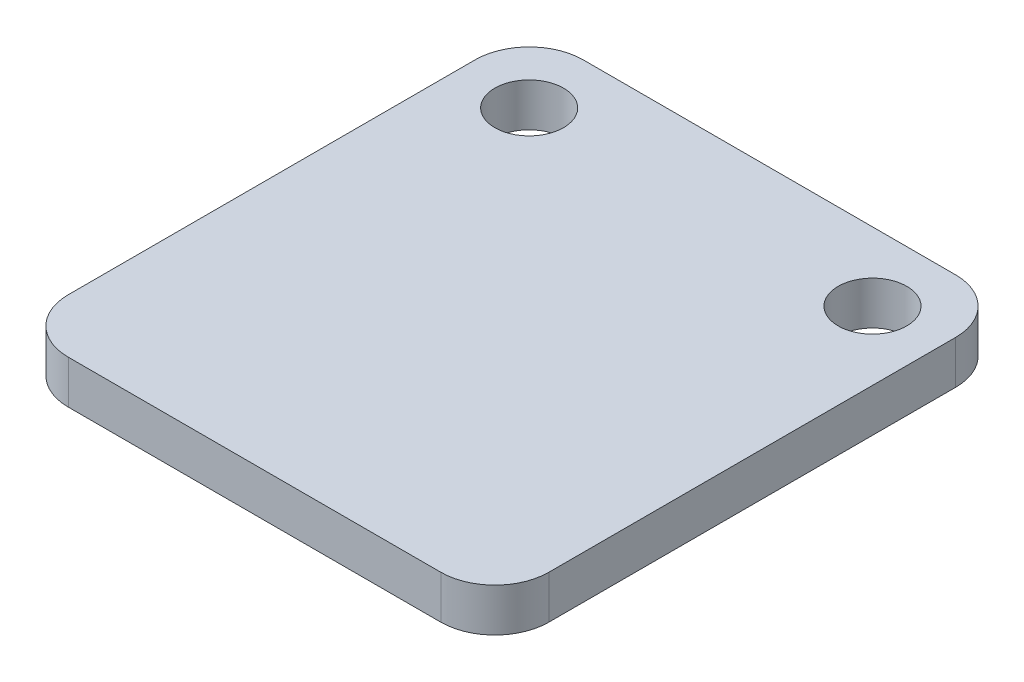
ISO-10303-21;
HEADER;
FILE_DESCRIPTION(('STEP AP214'),'2;1');
FILE_NAME('part.step','',(''),(''),'','','');
FILE_SCHEMA(('AUTOMOTIVE_DESIGN { 1 0 10303 214 1 1 1 1 }'));
ENDSEC;
DATA;
#1=APPLICATION_CONTEXT('core data for automotive mechanical design processes');
#2=APPLICATION_PROTOCOL_DEFINITION('international standard','automotive_design',2000,#1);
#3=PRODUCT_CONTEXT('',#1,'mechanical');
#4=PRODUCT('Part','Part','',(#3));
#5=PRODUCT_RELATED_PRODUCT_CATEGORY('part','',(#4));
#6=PRODUCT_DEFINITION_FORMATION('','',#4);
#7=PRODUCT_DEFINITION_CONTEXT('part definition',#1,'design');
#8=PRODUCT_DEFINITION('design','',#6,#7);
#9=PRODUCT_DEFINITION_SHAPE('','',#8);
#10=(LENGTH_UNIT() NAMED_UNIT(*) SI_UNIT(.MILLI.,.METRE.));
#11=(NAMED_UNIT(*) PLANE_ANGLE_UNIT() SI_UNIT($,.RADIAN.));
#12=(NAMED_UNIT(*) SI_UNIT($,.STERADIAN.) SOLID_ANGLE_UNIT());
#13=UNCERTAINTY_MEASURE_WITH_UNIT(LENGTH_MEASURE(1.E-05),#10,'distance_accuracy_value','');
#14=(GEOMETRIC_REPRESENTATION_CONTEXT(3) GLOBAL_UNCERTAINTY_ASSIGNED_CONTEXT((#13)) GLOBAL_UNIT_ASSIGNED_CONTEXT((#10,
#11,#12)) REPRESENTATION_CONTEXT('',''));
#15=CARTESIAN_POINT('',(0.,0.,0.));
#16=DIRECTION('',(0.,0.,1.));
#17=DIRECTION('',(1.,0.,0.));
#18=AXIS2_PLACEMENT_3D('',#15,#16,#17);
#19=CARTESIAN_POINT('',(-6.89,1.6,7.525));
#20=DIRECTION('',(0.,-1.,0.));
#21=DIRECTION('',(0.,0.,-1.));
#22=AXIS2_PLACEMENT_3D('',#19,#20,#21);
#23=CYLINDRICAL_SURFACE('',#22,2.);
#24=CARTESIAN_POINT('',(-6.89,0.,7.525));
#25=DIRECTION('',(0.,1.,0.));
#26=DIRECTION('',(0.,0.,1.));
#27=AXIS2_PLACEMENT_3D('',#24,#25,#26);
#28=CIRCLE('',#27,2.);
#29=CARTESIAN_POINT('',(-8.89,0.,7.52499999999999));
#30=VERTEX_POINT('',#29);
#31=CARTESIAN_POINT('',(-6.88999999999999,0.,9.525));
#32=VERTEX_POINT('',#31);
#33=EDGE_CURVE('E146',#30,#32,#28,.T.);
#34=ORIENTED_EDGE('',*,*,#33,.T.);
#35=DIRECTION('',(0.,-1.,0.));
#36=VECTOR('',#35,1.);
#37=CARTESIAN_POINT('',(-6.88999999999999,1.6,9.525));
#38=LINE('',#37,#36);
#39=CARTESIAN_POINT('',(-6.88999999999999,1.6,9.525));
#40=VERTEX_POINT('',#39);
#41=EDGE_CURVE('E11',#40,#32,#38,.T.);
#42=ORIENTED_EDGE('',*,*,#41,.F.);
#43=CARTESIAN_POINT('',(-6.89,1.6,7.525));
#44=DIRECTION('',(0.,1.,0.));
#45=DIRECTION('',(0.,0.,1.));
#46=AXIS2_PLACEMENT_3D('',#43,#44,#45);
#47=CIRCLE('',#46,2.);
#48=CARTESIAN_POINT('',(-8.89,1.6,7.52499999999999));
#49=VERTEX_POINT('',#48);
#50=EDGE_CURVE('E169',#49,#40,#47,.T.);
#51=ORIENTED_EDGE('',*,*,#50,.F.);
#52=DIRECTION('',(0.,-1.,0.));
#53=VECTOR('',#52,1.);
#54=CARTESIAN_POINT('',(-8.89,1.6,7.52499999999999));
#55=LINE('',#54,#53);
#56=EDGE_CURVE('E142',#49,#30,#55,.T.);
#57=ORIENTED_EDGE('',*,*,#56,.T.);
#58=EDGE_LOOP('',(#34,#42,#51,#57));
#59=FACE_BOUND('',#58,.T.);
#60=ADVANCED_FACE('F45',(#59),#23,.T.);
#61=CARTESIAN_POINT('',(-6.88999999999999,1.6,9.525));
#62=DIRECTION('',(0.,0.,-1.));
#63=DIRECTION('',(-1.,0.,0.));
#64=AXIS2_PLACEMENT_3D('',#61,#62,#63);
#65=PLANE('',#64);
#66=DIRECTION('',(1.,0.,0.));
#67=VECTOR('',#66,1.);
#68=CARTESIAN_POINT('',(-6.88999999999999,0.,9.525));
#69=LINE('',#68,#67);
#70=CARTESIAN_POINT('',(6.88999999999998,0.,9.525));
#71=VERTEX_POINT('',#70);
#72=EDGE_CURVE('E150',#32,#71,#69,.T.);
#73=ORIENTED_EDGE('',*,*,#72,.T.);
#74=DIRECTION('',(0.,-1.,0.));
#75=VECTOR('',#74,1.);
#76=CARTESIAN_POINT('',(6.88999999999998,1.6,9.525));
#77=LINE('',#76,#75);
#78=CARTESIAN_POINT('',(6.88999999999998,1.6,9.525));
#79=VERTEX_POINT('',#78);
#80=EDGE_CURVE('E54',#79,#71,#77,.T.);
#81=ORIENTED_EDGE('',*,*,#80,.F.);
#82=DIRECTION('',(1.,0.,0.));
#83=VECTOR('',#82,1.);
#84=CARTESIAN_POINT('',(-6.88999999999999,1.6,9.525));
#85=LINE('',#84,#83);
#86=EDGE_CURVE('E105',#40,#79,#85,.T.);
#87=ORIENTED_EDGE('',*,*,#86,.F.);
#88=ORIENTED_EDGE('',*,*,#41,.T.);
#89=EDGE_LOOP('',(#73,#81,#87,#88));
#90=FACE_BOUND('',#89,.T.);
#91=ADVANCED_FACE('F253',(#90),#65,.F.);
#92=CARTESIAN_POINT('',(6.89,1.6,7.525));
#93=DIRECTION('',(0.,-1.,0.));
#94=DIRECTION('',(0.,0.,-1.));
#95=AXIS2_PLACEMENT_3D('',#92,#93,#94);
#96=CYLINDRICAL_SURFACE('',#95,2.);
#97=CARTESIAN_POINT('',(6.89,0.,7.525));
#98=DIRECTION('',(0.,1.,0.));
#99=DIRECTION('',(0.,0.,1.));
#100=AXIS2_PLACEMENT_3D('',#97,#98,#99);
#101=CIRCLE('',#100,2.);
#102=CARTESIAN_POINT('',(8.89,0.,7.52499999999999));
#103=VERTEX_POINT('',#102);
#104=EDGE_CURVE('E154',#71,#103,#101,.T.);
#105=ORIENTED_EDGE('',*,*,#104,.T.);
#106=DIRECTION('',(0.,-1.,0.));
#107=VECTOR('',#106,1.);
#108=CARTESIAN_POINT('',(8.89,1.6,7.52499999999999));
#109=LINE('',#108,#107);
#110=CARTESIAN_POINT('',(8.89,1.6,7.52499999999999));
#111=VERTEX_POINT('',#110);
#112=EDGE_CURVE('E180',#111,#103,#109,.T.);
#113=ORIENTED_EDGE('',*,*,#112,.F.);
#114=CARTESIAN_POINT('',(6.89,1.6,7.525));
#115=DIRECTION('',(0.,1.,0.));
#116=DIRECTION('',(0.,0.,1.));
#117=AXIS2_PLACEMENT_3D('',#114,#115,#116);
#118=CIRCLE('',#117,2.);
#119=EDGE_CURVE('E190',#79,#111,#118,.T.);
#120=ORIENTED_EDGE('',*,*,#119,.F.);
#121=ORIENTED_EDGE('',*,*,#80,.T.);
#122=EDGE_LOOP('',(#105,#113,#120,#121));
#123=FACE_BOUND('',#122,.T.);
#124=ADVANCED_FACE('F188',(#123),#96,.T.);
#125=CARTESIAN_POINT('',(8.89,1.6,-7.52499999999999));
#126=DIRECTION('',(-1.,0.,0.));
#127=DIRECTION('',(0.,0.,1.));
#128=AXIS2_PLACEMENT_3D('',#125,#126,#127);
#129=PLANE('',#128);
#130=DIRECTION('',(0.,0.,-1.));
#131=VECTOR('',#130,1.);
#132=CARTESIAN_POINT('',(8.89,0.,-7.52499999999999));
#133=LINE('',#132,#131);
#134=CARTESIAN_POINT('',(8.89,0.,-7.52499999999999));
#135=VERTEX_POINT('',#134);
#136=EDGE_CURVE('E157',#103,#135,#133,.T.);
#137=ORIENTED_EDGE('',*,*,#136,.T.);
#138=DIRECTION('',(0.,-1.,0.));
#139=VECTOR('',#138,1.);
#140=CARTESIAN_POINT('',(8.89,1.6,-7.52499999999999));
#141=LINE('',#140,#139);
#142=CARTESIAN_POINT('',(8.89,1.6,-7.52499999999999));
#143=VERTEX_POINT('',#142);
#144=EDGE_CURVE('E176',#143,#135,#141,.T.);
#145=ORIENTED_EDGE('',*,*,#144,.F.);
#146=DIRECTION('',(0.,0.,-1.));
#147=VECTOR('',#146,1.);
#148=CARTESIAN_POINT('',(8.89,1.6,-7.52499999999999));
#149=LINE('',#148,#147);
#150=EDGE_CURVE('E203',#111,#143,#149,.T.);
#151=ORIENTED_EDGE('',*,*,#150,.F.);
#152=ORIENTED_EDGE('',*,*,#112,.T.);
#153=EDGE_LOOP('',(#137,#145,#151,#152));
#154=FACE_BOUND('',#153,.T.);
#155=ADVANCED_FACE('F198',(#154),#129,.F.);
#156=CARTESIAN_POINT('',(6.89,1.6,-7.525));
#157=DIRECTION('',(0.,-1.,0.));
#158=DIRECTION('',(0.,0.,-1.));
#159=AXIS2_PLACEMENT_3D('',#156,#157,#158);
#160=CYLINDRICAL_SURFACE('',#159,2.);
#161=CARTESIAN_POINT('',(6.89,0.,-7.525));
#162=DIRECTION('',(0.,1.,0.));
#163=DIRECTION('',(0.,0.,-1.));
#164=AXIS2_PLACEMENT_3D('',#161,#162,#163);
#165=CIRCLE('',#164,2.);
#166=CARTESIAN_POINT('',(6.88999999999998,0.,-9.525));
#167=VERTEX_POINT('',#166);
#168=EDGE_CURVE('E160',#135,#167,#165,.T.);
#169=ORIENTED_EDGE('',*,*,#168,.T.);
#170=DIRECTION('',(0.,-1.,0.));
#171=VECTOR('',#170,1.);
#172=CARTESIAN_POINT('',(6.88999999999998,1.6,-9.525));
#173=LINE('',#172,#171);
#174=CARTESIAN_POINT('',(6.88999999999998,1.6,-9.525));
#175=VERTEX_POINT('',#174);
#176=EDGE_CURVE('E135',#175,#167,#173,.T.);
#177=ORIENTED_EDGE('',*,*,#176,.F.);
#178=CARTESIAN_POINT('',(6.89,1.6,-7.525));
#179=DIRECTION('',(0.,1.,0.));
#180=DIRECTION('',(0.,0.,-1.));
#181=AXIS2_PLACEMENT_3D('',#178,#179,#180);
#182=CIRCLE('',#181,2.);
#183=EDGE_CURVE('E124',#143,#175,#182,.T.);
#184=ORIENTED_EDGE('',*,*,#183,.F.);
#185=ORIENTED_EDGE('',*,*,#144,.T.);
#186=EDGE_LOOP('',(#169,#177,#184,#185));
#187=FACE_BOUND('',#186,.T.);
#188=ADVANCED_FACE('F201',(#187),#160,.T.);
#189=CARTESIAN_POINT('',(-6.88999999999999,1.6,-9.525));
#190=DIRECTION('',(0.,0.,1.));
#191=DIRECTION('',(1.,0.,0.));
#192=AXIS2_PLACEMENT_3D('',#189,#190,#191);
#193=PLANE('',#192);
#194=DIRECTION('',(-1.,0.,0.));
#195=VECTOR('',#194,1.);
#196=CARTESIAN_POINT('',(-6.88999999999999,0.,-9.525));
#197=LINE('',#196,#195);
#198=CARTESIAN_POINT('',(-6.88999999999999,0.,-9.525));
#199=VERTEX_POINT('',#198);
#200=EDGE_CURVE('E133',#167,#199,#197,.T.);
#201=ORIENTED_EDGE('',*,*,#200,.T.);
#202=DIRECTION('',(0.,-1.,0.));
#203=VECTOR('',#202,1.);
#204=CARTESIAN_POINT('',(-6.88999999999999,1.6,-9.525));
#205=LINE('',#204,#203);
#206=CARTESIAN_POINT('',(-6.88999999999999,1.6,-9.525));
#207=VERTEX_POINT('',#206);
#208=EDGE_CURVE('E130',#207,#199,#205,.T.);
#209=ORIENTED_EDGE('',*,*,#208,.F.);
#210=DIRECTION('',(-1.,0.,0.));
#211=VECTOR('',#210,1.);
#212=CARTESIAN_POINT('',(-6.88999999999999,1.6,-9.525));
#213=LINE('',#212,#211);
#214=EDGE_CURVE('E118',#175,#207,#213,.T.);
#215=ORIENTED_EDGE('',*,*,#214,.F.);
#216=ORIENTED_EDGE('',*,*,#176,.T.);
#217=EDGE_LOOP('',(#201,#209,#215,#216));
#218=FACE_BOUND('',#217,.T.);
#219=ADVANCED_FACE('F131',(#218),#193,.F.);
#220=CARTESIAN_POINT('',(-6.89,1.6,-7.525));
#221=DIRECTION('',(0.,-1.,0.));
#222=DIRECTION('',(0.,0.,-1.));
#223=AXIS2_PLACEMENT_3D('',#220,#221,#222);
#224=CYLINDRICAL_SURFACE('',#223,2.);
#225=CARTESIAN_POINT('',(-6.89,0.,-7.525));
#226=DIRECTION('',(0.,1.,0.));
#227=DIRECTION('',(0.,0.,1.));
#228=AXIS2_PLACEMENT_3D('',#225,#226,#227);
#229=CIRCLE('',#228,2.);
#230=CARTESIAN_POINT('',(-8.89,0.,-7.52499999999999));
#231=VERTEX_POINT('',#230);
#232=EDGE_CURVE('E91',#199,#231,#229,.T.);
#233=ORIENTED_EDGE('',*,*,#232,.T.);
#234=DIRECTION('',(0.,-1.,0.));
#235=VECTOR('',#234,1.);
#236=CARTESIAN_POINT('',(-8.89,1.6,-7.52499999999999));
#237=LINE('',#236,#235);
#238=CARTESIAN_POINT('',(-8.89,1.6,-7.52499999999999));
#239=VERTEX_POINT('',#238);
#240=EDGE_CURVE('E136',#239,#231,#237,.T.);
#241=ORIENTED_EDGE('',*,*,#240,.F.);
#242=CARTESIAN_POINT('',(-6.89,1.6,-7.525));
#243=DIRECTION('',(0.,1.,0.));
#244=DIRECTION('',(0.,0.,1.));
#245=AXIS2_PLACEMENT_3D('',#242,#243,#244);
#246=CIRCLE('',#245,2.);
#247=EDGE_CURVE('E122',#207,#239,#246,.T.);
#248=ORIENTED_EDGE('',*,*,#247,.F.);
#249=ORIENTED_EDGE('',*,*,#208,.T.);
#250=EDGE_LOOP('',(#233,#241,#248,#249));
#251=FACE_BOUND('',#250,.T.);
#252=ADVANCED_FACE('F138',(#251),#224,.T.);
#253=CARTESIAN_POINT('',(-8.89,1.6,-7.52499999999999));
#254=DIRECTION('',(1.,0.,0.));
#255=DIRECTION('',(0.,0.,-1.));
#256=AXIS2_PLACEMENT_3D('',#253,#254,#255);
#257=PLANE('',#256);
#258=DIRECTION('',(0.,0.,1.));
#259=VECTOR('',#258,1.);
#260=CARTESIAN_POINT('',(-8.89,0.,-7.52499999999999));
#261=LINE('',#260,#259);
#262=EDGE_CURVE('E97',#231,#30,#261,.T.);
#263=ORIENTED_EDGE('',*,*,#262,.T.);
#264=ORIENTED_EDGE('',*,*,#56,.F.);
#265=DIRECTION('',(0.,0.,1.));
#266=VECTOR('',#265,1.);
#267=CARTESIAN_POINT('',(-8.89,1.6,-7.52499999999999));
#268=LINE('',#267,#266);
#269=EDGE_CURVE('E62',#239,#49,#268,.T.);
#270=ORIENTED_EDGE('',*,*,#269,.F.);
#271=ORIENTED_EDGE('',*,*,#240,.T.);
#272=EDGE_LOOP('',(#263,#264,#270,#271));
#273=FACE_BOUND('',#272,.T.);
#274=ADVANCED_FACE('F240',(#273),#257,.F.);
#275=CARTESIAN_POINT('',(-6.89,1.6,7.525));
#276=DIRECTION('',(0.,1.,0.));
#277=DIRECTION('',(0.,0.,1.));
#278=AXIS2_PLACEMENT_3D('',#275,#276,#277);
#279=PLANE('',#278);
#280=CARTESIAN_POINT('',(-6.35,1.6,-6.985));
#281=DIRECTION('',(0.,1.,0.));
#282=DIRECTION('',(0.,0.,1.));
#283=AXIS2_PLACEMENT_3D('',#280,#281,#282);
#284=CIRCLE('',#283,1.27);
#285=CARTESIAN_POINT('',(-6.35,1.6,-5.715));
#286=VERTEX_POINT('',#285);
#287=EDGE_CURVE('E221',#286,#286,#284,.T.);
#288=ORIENTED_EDGE('',*,*,#287,.F.);
#289=EDGE_LOOP('',(#288));
#290=FACE_BOUND('',#289,.T.);
#291=CARTESIAN_POINT('',(6.35,1.6,-6.985));
#292=DIRECTION('',(0.,1.,0.));
#293=DIRECTION('',(0.,0.,1.));
#294=AXIS2_PLACEMENT_3D('',#291,#292,#293);
#295=CIRCLE('',#294,1.27);
#296=CARTESIAN_POINT('',(6.35,1.6,-5.715));
#297=VERTEX_POINT('',#296);
#298=EDGE_CURVE('E217',#297,#297,#295,.T.);
#299=ORIENTED_EDGE('',*,*,#298,.F.);
#300=EDGE_LOOP('',(#299));
#301=FACE_BOUND('',#300,.T.);
#302=ORIENTED_EDGE('',*,*,#50,.T.);
#303=ORIENTED_EDGE('',*,*,#86,.T.);
#304=ORIENTED_EDGE('',*,*,#119,.T.);
#305=ORIENTED_EDGE('',*,*,#150,.T.);
#306=ORIENTED_EDGE('',*,*,#183,.T.);
#307=ORIENTED_EDGE('',*,*,#214,.T.);
#308=ORIENTED_EDGE('',*,*,#247,.T.);
#309=ORIENTED_EDGE('',*,*,#269,.T.);
#310=EDGE_LOOP('',(#302,#303,#304,#305,#306,#307,#308,#309));
#311=FACE_BOUND('',#310,.T.);
#312=ADVANCED_FACE('F120',(#290,#301,#311),#279,.T.);
#313=CARTESIAN_POINT('',(-6.89,0.,7.525));
#314=DIRECTION('',(0.,1.,0.));
#315=DIRECTION('',(0.,0.,1.));
#316=AXIS2_PLACEMENT_3D('',#313,#314,#315);
#317=PLANE('',#316);
#318=CARTESIAN_POINT('',(-6.35,0.,-6.985));
#319=DIRECTION('',(0.,1.,0.));
#320=DIRECTION('',(0.,0.,1.));
#321=AXIS2_PLACEMENT_3D('',#318,#319,#320);
#322=CIRCLE('',#321,1.27);
#323=CARTESIAN_POINT('',(-6.35,0.,-5.715));
#324=VERTEX_POINT('',#323);
#325=EDGE_CURVE('E151',#324,#324,#322,.T.);
#326=ORIENTED_EDGE('',*,*,#325,.T.);
#327=EDGE_LOOP('',(#326));
#328=FACE_BOUND('',#327,.T.);
#329=CARTESIAN_POINT('',(6.35,0.,-6.985));
#330=DIRECTION('',(0.,1.,0.));
#331=DIRECTION('',(0.,0.,1.));
#332=AXIS2_PLACEMENT_3D('',#329,#330,#331);
#333=CIRCLE('',#332,1.27);
#334=CARTESIAN_POINT('',(6.35,0.,-5.715));
#335=VERTEX_POINT('',#334);
#336=EDGE_CURVE('E213',#335,#335,#333,.T.);
#337=ORIENTED_EDGE('',*,*,#336,.T.);
#338=EDGE_LOOP('',(#337));
#339=FACE_BOUND('',#338,.T.);
#340=ORIENTED_EDGE('',*,*,#33,.F.);
#341=ORIENTED_EDGE('',*,*,#262,.F.);
#342=ORIENTED_EDGE('',*,*,#232,.F.);
#343=ORIENTED_EDGE('',*,*,#200,.F.);
#344=ORIENTED_EDGE('',*,*,#168,.F.);
#345=ORIENTED_EDGE('',*,*,#136,.F.);
#346=ORIENTED_EDGE('',*,*,#104,.F.);
#347=ORIENTED_EDGE('',*,*,#72,.F.);
#348=EDGE_LOOP('',(#340,#341,#342,#343,#344,#345,#346,#347));
#349=FACE_BOUND('',#348,.T.);
#350=ADVANCED_FACE('F194',(#328,#339,#349),#317,.F.);
#351=CARTESIAN_POINT('',(6.35,0.,-6.985));
#352=DIRECTION('',(0.,1.,0.));
#353=DIRECTION('',(0.,0.,1.));
#354=AXIS2_PLACEMENT_3D('',#351,#352,#353);
#355=CYLINDRICAL_SURFACE('',#354,1.27);
#356=ORIENTED_EDGE('',*,*,#336,.F.);
#357=EDGE_LOOP('',(#356));
#358=FACE_BOUND('',#357,.T.);
#359=ORIENTED_EDGE('',*,*,#298,.T.);
#360=EDGE_LOOP('',(#359));
#361=FACE_BOUND('',#360,.T.);
#362=ADVANCED_FACE('F234',(#358,#361),#355,.F.);
#363=CARTESIAN_POINT('',(-6.35,0.,-6.985));
#364=DIRECTION('',(0.,1.,0.));
#365=DIRECTION('',(0.,0.,1.));
#366=AXIS2_PLACEMENT_3D('',#363,#364,#365);
#367=CYLINDRICAL_SURFACE('',#366,1.27);
#368=ORIENTED_EDGE('',*,*,#325,.F.);
#369=EDGE_LOOP('',(#368));
#370=FACE_BOUND('',#369,.T.);
#371=ORIENTED_EDGE('',*,*,#287,.T.);
#372=EDGE_LOOP('',(#371));
#373=FACE_BOUND('',#372,.T.);
#374=ADVANCED_FACE('F231',(#370,#373),#367,.F.);
#375=CLOSED_SHELL('',(#60,#91,#124,#155,#188,#219,#252,#274,#312,#350,#362,#374));
#376=MANIFOLD_SOLID_BREP('B2',#375);
#377=ADVANCED_BREP_SHAPE_REPRESENTATION('',(#18,#376),#14);
#378=SHAPE_DEFINITION_REPRESENTATION(#9,#377);
ENDSEC;
END-ISO-10303-21;
